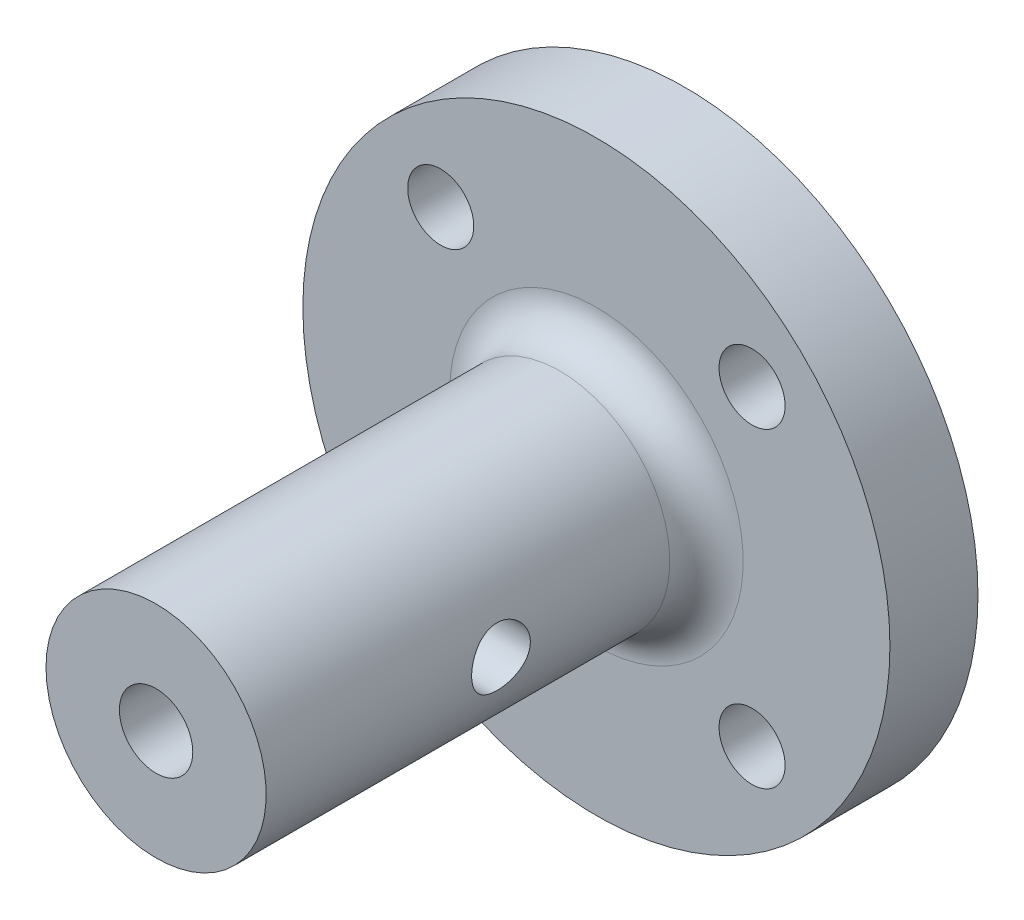
ISO-10303-21;
HEADER;
FILE_DESCRIPTION(('STEP AP214'),'2;1');
FILE_NAME('part.step','',(''),(''),'','','');
FILE_SCHEMA(('AUTOMOTIVE_DESIGN { 1 0 10303 214 1 1 1 1 }'));
ENDSEC;
DATA;
#1=APPLICATION_CONTEXT('core data for automotive mechanical design processes');
#2=APPLICATION_PROTOCOL_DEFINITION('international standard','automotive_design',2000,#1);
#3=PRODUCT_CONTEXT('',#1,'mechanical');
#4=PRODUCT('Part','Part','',(#3));
#5=PRODUCT_RELATED_PRODUCT_CATEGORY('part','',(#4));
#6=PRODUCT_DEFINITION_FORMATION('','',#4);
#7=PRODUCT_DEFINITION_CONTEXT('part definition',#1,'design');
#8=PRODUCT_DEFINITION('design','',#6,#7);
#9=PRODUCT_DEFINITION_SHAPE('','',#8);
#10=(LENGTH_UNIT() NAMED_UNIT(*) SI_UNIT(.MILLI.,.METRE.));
#11=(NAMED_UNIT(*) PLANE_ANGLE_UNIT() SI_UNIT($,.RADIAN.));
#12=(NAMED_UNIT(*) SI_UNIT($,.STERADIAN.) SOLID_ANGLE_UNIT());
#13=UNCERTAINTY_MEASURE_WITH_UNIT(LENGTH_MEASURE(1.E-05),#10,'distance_accuracy_value','');
#14=(GEOMETRIC_REPRESENTATION_CONTEXT(3) GLOBAL_UNCERTAINTY_ASSIGNED_CONTEXT((#13)) GLOBAL_UNIT_ASSIGNED_CONTEXT((#10,
#11,#12)) REPRESENTATION_CONTEXT('',''));
#15=CARTESIAN_POINT('',(0.,0.,0.));
#16=DIRECTION('',(0.,0.,1.));
#17=DIRECTION('',(1.,0.,0.));
#18=AXIS2_PLACEMENT_3D('',#15,#16,#17);
#19=CARTESIAN_POINT('',(0.,0.,0.));
#20=DIRECTION('',(0.,0.,1.));
#21=DIRECTION('',(1.,0.,0.));
#22=AXIS2_PLACEMENT_3D('',#19,#20,#21);
#23=PLANE('',#22);
#24=CARTESIAN_POINT('',(21.213203,-21.213203,0.));
#25=DIRECTION('',(0.,0.,1.));
#26=DIRECTION('',(1.,0.,0.));
#27=AXIS2_PLACEMENT_3D('',#24,#25,#26);
#28=CIRCLE('',#27,4.5);
#29=CARTESIAN_POINT('',(25.713203,-21.213203,0.));
#30=VERTEX_POINT('',#29);
#31=EDGE_CURVE('E174',#30,#30,#28,.T.);
#32=ORIENTED_EDGE('',*,*,#31,.T.);
#33=EDGE_LOOP('',(#32));
#34=FACE_BOUND('',#33,.T.);
#35=CARTESIAN_POINT('',(-21.213203,-21.213203,0.));
#36=DIRECTION('',(0.,0.,1.));
#37=DIRECTION('',(1.,0.,0.));
#38=AXIS2_PLACEMENT_3D('',#35,#36,#37);
#39=CIRCLE('',#38,4.5);
#40=CARTESIAN_POINT('',(-16.713203,-21.213203,0.));
#41=VERTEX_POINT('',#40);
#42=EDGE_CURVE('E179',#41,#41,#39,.T.);
#43=ORIENTED_EDGE('',*,*,#42,.T.);
#44=EDGE_LOOP('',(#43));
#45=FACE_BOUND('',#44,.T.);
#46=CARTESIAN_POINT('',(-21.213203,21.213203,0.));
#47=DIRECTION('',(0.,0.,1.));
#48=DIRECTION('',(1.,0.,0.));
#49=AXIS2_PLACEMENT_3D('',#46,#47,#48);
#50=CIRCLE('',#49,4.5);
#51=CARTESIAN_POINT('',(-16.713203,21.213203,0.));
#52=VERTEX_POINT('',#51);
#53=EDGE_CURVE('E184',#52,#52,#50,.T.);
#54=ORIENTED_EDGE('',*,*,#53,.T.);
#55=EDGE_LOOP('',(#54));
#56=FACE_BOUND('',#55,.T.);
#57=CARTESIAN_POINT('',(21.213203,21.213203,0.));
#58=DIRECTION('',(0.,0.,1.));
#59=DIRECTION('',(1.,0.,0.));
#60=AXIS2_PLACEMENT_3D('',#57,#58,#59);
#61=CIRCLE('',#60,4.5);
#62=CARTESIAN_POINT('',(25.713203,21.213203,0.));
#63=VERTEX_POINT('',#62);
#64=EDGE_CURVE('E170',#63,#63,#61,.T.);
#65=ORIENTED_EDGE('',*,*,#64,.T.);
#66=EDGE_LOOP('',(#65));
#67=FACE_BOUND('',#66,.T.);
#68=CARTESIAN_POINT('',(0.,0.,0.));
#69=DIRECTION('',(0.,0.,-1.));
#70=DIRECTION('',(-1.,0.,0.));
#71=AXIS2_PLACEMENT_3D('',#68,#69,#70);
#72=CIRCLE('',#71,40.);
#73=CARTESIAN_POINT('',(-40.,0.,0.));
#74=VERTEX_POINT('',#73);
#75=EDGE_CURVE('E64',#74,#74,#72,.T.);
#76=ORIENTED_EDGE('',*,*,#75,.T.);
#77=EDGE_LOOP('',(#76));
#78=FACE_BOUND('',#77,.T.);
#79=ADVANCED_FACE('F49',(#34,#45,#56,#67,#78),#23,.F.);
#80=CARTESIAN_POINT('',(0.,0.,0.));
#81=DIRECTION('',(0.,0.,-1.));
#82=DIRECTION('',(-1.,0.,0.));
#83=AXIS2_PLACEMENT_3D('',#80,#81,#82);
#84=CYLINDRICAL_SURFACE('',#83,40.);
#85=ORIENTED_EDGE('',*,*,#75,.F.);
#86=EDGE_LOOP('',(#85));
#87=FACE_BOUND('',#86,.T.);
#88=CARTESIAN_POINT('',(0.,0.,12.));
#89=DIRECTION('',(0.,0.,-1.));
#90=DIRECTION('',(-1.,0.,0.));
#91=AXIS2_PLACEMENT_3D('',#88,#89,#90);
#92=CIRCLE('',#91,40.);
#93=CARTESIAN_POINT('',(-40.,0.,12.));
#94=VERTEX_POINT('',#93);
#95=EDGE_CURVE('E68',#94,#94,#92,.T.);
#96=ORIENTED_EDGE('',*,*,#95,.T.);
#97=EDGE_LOOP('',(#96));
#98=FACE_BOUND('',#97,.T.);
#99=ADVANCED_FACE('F120',(#87,#98),#84,.T.);
#100=CARTESIAN_POINT('',(40.,0.,12.));
#101=DIRECTION('',(0.,0.,-1.));
#102=DIRECTION('',(-1.,0.,0.));
#103=AXIS2_PLACEMENT_3D('',#100,#101,#102);
#104=PLANE('',#103);
#105=CARTESIAN_POINT('',(0.,0.,12.));
#106=DIRECTION('',(0.,0.,-1.));
#107=DIRECTION('',(-1.,0.,0.));
#108=AXIS2_PLACEMENT_3D('',#105,#106,#107);
#109=CIRCLE('',#108,20.);
#110=CARTESIAN_POINT('',(-20.,0.,12.));
#111=VERTEX_POINT('',#110);
#112=EDGE_CURVE('E58',#111,#111,#109,.T.);
#113=ORIENTED_EDGE('',*,*,#112,.T.);
#114=EDGE_LOOP('',(#113));
#115=FACE_BOUND('',#114,.T.);
#116=CARTESIAN_POINT('',(21.213203,-21.213203,12.));
#117=DIRECTION('',(0.,0.,1.));
#118=DIRECTION('',(1.,0.,0.));
#119=AXIS2_PLACEMENT_3D('',#116,#117,#118);
#120=CIRCLE('',#119,4.5);
#121=CARTESIAN_POINT('',(25.713203,-21.213203,12.));
#122=VERTEX_POINT('',#121);
#123=EDGE_CURVE('E137',#122,#122,#120,.T.);
#124=ORIENTED_EDGE('',*,*,#123,.F.);
#125=EDGE_LOOP('',(#124));
#126=FACE_BOUND('',#125,.T.);
#127=CARTESIAN_POINT('',(-21.213203,-21.213203,12.));
#128=DIRECTION('',(0.,0.,1.));
#129=DIRECTION('',(1.,0.,0.));
#130=AXIS2_PLACEMENT_3D('',#127,#128,#129);
#131=CIRCLE('',#130,4.5);
#132=CARTESIAN_POINT('',(-16.713203,-21.213203,12.));
#133=VERTEX_POINT('',#132);
#134=EDGE_CURVE('E141',#133,#133,#131,.T.);
#135=ORIENTED_EDGE('',*,*,#134,.F.);
#136=EDGE_LOOP('',(#135));
#137=FACE_BOUND('',#136,.T.);
#138=CARTESIAN_POINT('',(-21.213203,21.213203,12.));
#139=DIRECTION('',(0.,0.,1.));
#140=DIRECTION('',(1.,0.,0.));
#141=AXIS2_PLACEMENT_3D('',#138,#139,#140);
#142=CIRCLE('',#141,4.5);
#143=CARTESIAN_POINT('',(-16.713203,21.213203,12.));
#144=VERTEX_POINT('',#143);
#145=EDGE_CURVE('E145',#144,#144,#142,.T.);
#146=ORIENTED_EDGE('',*,*,#145,.F.);
#147=EDGE_LOOP('',(#146));
#148=FACE_BOUND('',#147,.T.);
#149=CARTESIAN_POINT('',(21.213203,21.213203,12.));
#150=DIRECTION('',(0.,0.,1.));
#151=DIRECTION('',(1.,0.,0.));
#152=AXIS2_PLACEMENT_3D('',#149,#150,#151);
#153=CIRCLE('',#152,4.5);
#154=CARTESIAN_POINT('',(25.713203,21.213203,12.));
#155=VERTEX_POINT('',#154);
#156=EDGE_CURVE('E149',#155,#155,#153,.T.);
#157=ORIENTED_EDGE('',*,*,#156,.F.);
#158=EDGE_LOOP('',(#157));
#159=FACE_BOUND('',#158,.T.);
#160=ORIENTED_EDGE('',*,*,#95,.F.);
#161=EDGE_LOOP('',(#160));
#162=FACE_BOUND('',#161,.T.);
#163=ADVANCED_FACE('F116',(#115,#126,#137,#148,#159,#162),#104,.F.);
#164=CARTESIAN_POINT('',(0.,0.,0.));
#165=DIRECTION('',(0.,0.,-1.));
#166=DIRECTION('',(-1.,0.,0.));
#167=AXIS2_PLACEMENT_3D('',#164,#165,#166);
#168=CYLINDRICAL_SURFACE('',#167,15.);
#169=CARTESIAN_POINT('',(0.,0.,17.));
#170=DIRECTION('',(0.,0.,-1.));
#171=DIRECTION('',(-1.,0.,0.));
#172=AXIS2_PLACEMENT_3D('',#169,#170,#171);
#173=CIRCLE('',#172,15.);
#174=CARTESIAN_POINT('',(-15.,0.,17.));
#175=VERTEX_POINT('',#174);
#176=EDGE_CURVE('E10',#175,#175,#173,.F.);
#177=ORIENTED_EDGE('',*,*,#176,.T.);
#178=EDGE_LOOP('',(#177));
#179=FACE_BOUND('',#178,.T.);
#180=CARTESIAN_POINT('',(-15.,0.,44.));
#181=CARTESIAN_POINT('',(-14.9999966762032,-0.220509111665708,43.9999947661303));
#182=CARTESIAN_POINT('',(-14.995089723243,-0.44107432044368,43.9817047716207));
#183=CARTESIAN_POINT('',(-14.9759914724332,-0.875850902708926,43.9091575385226));
#184=CARTESIAN_POINT('',(-14.9617957066517,-1.09005916663817,43.8548829911478));
#185=CARTESIAN_POINT('',(-14.9256866650558,-1.50578317809062,43.7122566662719));
#186=CARTESIAN_POINT('',(-14.9037833426075,-1.70731490203057,43.623948824668));
#187=CARTESIAN_POINT('',(-14.8545739830336,-2.09270737278532,43.4159255146668));
#188=CARTESIAN_POINT('',(-14.8272675859036,-2.27656694089925,43.2962079532814));
#189=CARTESIAN_POINT('',(-14.7694922980399,-2.62565900748003,43.0258329671733));
#190=CARTESIAN_POINT('',(-14.7389693535736,-2.79042337972557,42.8745826639835));
#191=CARTESIAN_POINT('',(-14.6785481935918,-3.09257427321275,42.5467030338733));
#192=CARTESIAN_POINT('',(-14.6486500589449,-3.22995726991328,42.3700704447649));
#193=CARTESIAN_POINT('',(-14.5923107492874,-3.4757281848683,41.9927035303491));
#194=CARTESIAN_POINT('',(-14.5659377712648,-3.58357755472974,41.7916073434765));
#195=CARTESIAN_POINT('',(-14.5204295463637,-3.76375096153988,41.3733197778151));
#196=CARTESIAN_POINT('',(-14.5012929650653,-3.83608154902737,41.1561313753371));
#197=CARTESIAN_POINT('',(-14.472982316048,-3.94153840453008,40.71700892435));
#198=CARTESIAN_POINT('',(-14.4635929562298,-3.97551340489383,40.4952929201385));
#199=CARTESIAN_POINT('',(-14.4551966183274,-4.00594069411639,40.0491246333869));
#200=CARTESIAN_POINT('',(-14.4561877002889,-4.00239999411507,39.8246728699519));
#201=CARTESIAN_POINT('',(-14.4682475760406,-3.95857020005398,39.3860291692519));
#202=CARTESIAN_POINT('',(-14.4790347102306,-3.91930812129529,39.171725635923));
#203=CARTESIAN_POINT('',(-14.5090202616138,-3.80679497444365,38.7528633310875));
#204=CARTESIAN_POINT('',(-14.5282193510522,-3.73354118985989,38.5483053398493));
#205=CARTESIAN_POINT('',(-14.5731132349677,-3.55428713930511,38.1520637123828));
#206=CARTESIAN_POINT('',(-14.5988788563741,-3.44792682275569,37.9605513214275));
#207=CARTESIAN_POINT('',(-14.6539645928489,-3.20573007647555,37.597731682297));
#208=CARTESIAN_POINT('',(-14.6832854071037,-3.06988784448503,37.4264284216871));
#209=CARTESIAN_POINT('',(-14.7433502125973,-2.76733214526838,37.1030220050904));
#210=CARTESIAN_POINT('',(-14.7741094297766,-2.59975625456598,36.9517273633701));
#211=CARTESIAN_POINT('',(-14.8327276255263,-2.24123533641274,36.6792224392994));
#212=CARTESIAN_POINT('',(-14.8605864897711,-2.05028938841018,36.5580133425951));
#213=CARTESIAN_POINT('',(-14.9104364079659,-1.6491965109949,36.3487641943507));
#214=CARTESIAN_POINT('',(-14.9324014566712,-1.43896980510357,36.2608704591028));
#215=CARTESIAN_POINT('',(-14.96780088802,-1.00600458878079,36.1219056223733));
#216=CARTESIAN_POINT('',(-14.981237134675,-0.783268823856645,36.0708264745521));
#217=CARTESIAN_POINT('',(-14.9977831711677,-0.33850816629103,36.0082102461644));
#218=CARTESIAN_POINT('',(-15.0011799494192,-0.11664847528276,35.9955739202983));
#219=CARTESIAN_POINT('',(-14.9980894338339,0.326020091802398,36.0071663284939));
#220=CARTESIAN_POINT('',(-14.9916031616071,0.546829074124229,36.0313912522115));
#221=CARTESIAN_POINT('',(-14.9696607099204,0.977204899803559,36.11511689492));
#222=CARTESIAN_POINT('',(-14.9543605309265,1.18689970405556,36.1740044923955));
#223=CARTESIAN_POINT('',(-14.9165258978828,1.59341394235213,36.3246718890159));
#224=CARTESIAN_POINT('',(-14.8939906599234,1.79023197843205,36.4164552525011));
#225=CARTESIAN_POINT('',(-14.8435132111904,2.1696769493359,36.6323477743611));
#226=CARTESIAN_POINT('',(-14.8154737320985,2.35195037692236,36.7570549335955));
#227=CARTESIAN_POINT('',(-14.7572290473119,2.69336927079429,37.034503260316));
#228=CARTESIAN_POINT('',(-14.7270234145527,2.85251015759837,37.1872499652021));
#229=CARTESIAN_POINT('',(-14.6667949173317,3.14777848957546,37.5215711549892));
#230=CARTESIAN_POINT('',(-14.6368012285772,3.28313038499626,37.7038371227905));
#231=CARTESIAN_POINT('',(-14.5813289436636,3.52134382370241,38.0891293921991));
#232=CARTESIAN_POINT('',(-14.5558501591602,3.62420672244342,38.292154827244));
#233=CARTESIAN_POINT('',(-14.5125853674305,3.79374823172204,38.7121906141529));
#234=CARTESIAN_POINT('',(-14.4947549662348,3.8606362450784,38.9291116236376));
#235=CARTESIAN_POINT('',(-14.4687965026614,3.95682410237656,39.3716786393471));
#236=CARTESIAN_POINT('',(-14.4606659608681,3.98613355205235,39.5973224006868));
#237=CARTESIAN_POINT('',(-14.4552348910192,4.00577979307211,40.0429895757886));
#238=CARTESIAN_POINT('',(-14.4575879532022,3.99736311235128,40.2629546405733));
#239=CARTESIAN_POINT('',(-14.4720479199639,3.94468751999857,40.6982070280705));
#240=CARTESIAN_POINT('',(-14.4841545735456,3.9004295306998,40.9134944710095));
#241=CARTESIAN_POINT('',(-14.5165514219021,3.77805031399794,41.3317115042402));
#242=CARTESIAN_POINT('',(-14.5367777005106,3.70019322151266,41.5347236854591));
#243=CARTESIAN_POINT('',(-14.5831363626058,3.51303109124665,41.9249576610735));
#244=CARTESIAN_POINT('',(-14.6092696723953,3.40372112049204,42.1121769726024));
#245=CARTESIAN_POINT('',(-14.6654584288421,3.15297818537663,42.4714607189918));
#246=CARTESIAN_POINT('',(-14.6956066620426,3.01069459535826,42.642917069952));
#247=CARTESIAN_POINT('',(-14.7559100756513,2.69966107022192,42.959924903335));
#248=CARTESIAN_POINT('',(-14.7860652559664,2.53090470871747,43.1054700773378));
#249=CARTESIAN_POINT('',(-14.8437562480818,2.16735996217739,43.3695844752936));
#250=CARTESIAN_POINT('',(-14.8712222262917,1.97209192350356,43.4875100212986));
#251=CARTESIAN_POINT('',(-14.9196762020573,1.56377728083377,43.6886748318588));
#252=CARTESIAN_POINT('',(-14.9406683536717,1.35074218939259,43.7719363513272));
#253=CARTESIAN_POINT('',(-14.9710950502695,0.948749409761979,43.890550570831));
#254=CARTESIAN_POINT('',(-14.9818554118521,0.761524033130069,43.931498767185));
#255=CARTESIAN_POINT('',(-14.9963089807291,0.38287959063415,43.9862244123341));
#256=CARTESIAN_POINT('',(-15.0000028859454,0.19146094080972,44.0000045444));
#257=CARTESIAN_POINT('',(-15.,0.,44.));
#258=B_SPLINE_CURVE_WITH_KNOTS('',3,(#180,#181,#182,#183,#184,#185,#186,#187,#188,#189,#190,
#191,#192,#193,#194,#195,#196,#197,#198,#199,#200,#201,#202,#203,#204,#205,#206,#207,#208,#209,
#210,#211,#212,#213,#214,#215,#216,#217,#218,#219,#220,#221,#222,#223,#224,#225,#226,#227,#228,
#229,#230,#231,#232,#233,#234,#235,#236,#237,#238,#239,#240,#241,#242,#243,#244,#245,#246,#247,
#248,#249,#250,#251,#252,#253,#254,#255,#256,#257),.UNSPECIFIED.,.T.,.F.,(4,2,2,2,2,2,2,2,2,2,2,
2,2,2,2,2,2,2,2,2,2,2,2,2,2,2,2,2,2,2,2,2,2,2,2,2,2,2,4),(0.,0.660825197899137,1.3219684875229,
1.98226110594386,2.6425977341735,3.31669795909933,3.99088489850297,4.67665165046458,
5.36229188259399,6.03244316500935,6.70246920808639,7.35382004091992,8.00522293625878,
8.66397346692995,9.32285376235258,10.0032251962464,10.6836234387519,11.3669761920608,
12.0501795438028,12.7136543504909,13.377060578507,14.0290707128423,14.6811515155123,
15.346005720091,16.0109913651777,16.6947299276558,17.3784399604821,18.0581259539877,
18.7376381732796,19.394866848109,20.0520786104837,20.7042153090379,21.3564543425319,
22.0278867914996,22.6994824867208,23.3854450456898,24.0709665229755,24.6447963799386,
25.2185695593995),.UNSPECIFIED.);
#259=CARTESIAN_POINT('',(-15.,0.,44.));
#260=VERTEX_POINT('',#259);
#261=EDGE_CURVE('E71',#260,#260,#258,.T.);
#262=ORIENTED_EDGE('',*,*,#261,.T.);
#263=EDGE_LOOP('',(#262));
#264=FACE_BOUND('',#263,.T.);
#265=CARTESIAN_POINT('',(15.,0.,36.));
#266=CARTESIAN_POINT('',(14.9999966762032,-0.220509111665708,36.0000052338697));
#267=CARTESIAN_POINT('',(14.995089723243,-0.441074320443681,36.0182952283794));
#268=CARTESIAN_POINT('',(14.9759914724332,-0.875850902708926,36.0908424614774));
#269=CARTESIAN_POINT('',(14.9617957066517,-1.09005916663817,36.1451170088522));
#270=CARTESIAN_POINT('',(14.9256866650558,-1.50578317809062,36.2877433337281));
#271=CARTESIAN_POINT('',(14.9037833426075,-1.70731490203057,36.376051175332));
#272=CARTESIAN_POINT('',(14.8545739830336,-2.09270737278532,36.5840744853332));
#273=CARTESIAN_POINT('',(14.8272675859036,-2.27656694089925,36.7037920467186));
#274=CARTESIAN_POINT('',(14.7694922980399,-2.62565900748003,36.9741670328267));
#275=CARTESIAN_POINT('',(14.7389693535736,-2.79042337972557,37.1254173360165));
#276=CARTESIAN_POINT('',(14.6785481935918,-3.09257427321275,37.4532969661267));
#277=CARTESIAN_POINT('',(14.6486500589449,-3.22995726991328,37.6299295552351));
#278=CARTESIAN_POINT('',(14.5923107492874,-3.4757281848683,38.0072964696509));
#279=CARTESIAN_POINT('',(14.5659377712648,-3.58357755472974,38.2083926565235));
#280=CARTESIAN_POINT('',(14.5204295463637,-3.76375096153988,38.6266802221849));
#281=CARTESIAN_POINT('',(14.5012929650653,-3.83608154902737,38.8438686246629));
#282=CARTESIAN_POINT('',(14.472982316048,-3.94153840453008,39.28299107565));
#283=CARTESIAN_POINT('',(14.4635929562298,-3.97551340489383,39.5047070798615));
#284=CARTESIAN_POINT('',(14.4551966183274,-4.00594069411639,39.9508753666131));
#285=CARTESIAN_POINT('',(14.4561877002889,-4.00239999411507,40.1753271300481));
#286=CARTESIAN_POINT('',(14.4682475760406,-3.95857020005398,40.6139708307481));
#287=CARTESIAN_POINT('',(14.4790347102306,-3.91930812129529,40.828274364077));
#288=CARTESIAN_POINT('',(14.5090202616138,-3.80679497444365,41.2471366689125));
#289=CARTESIAN_POINT('',(14.5282193510522,-3.73354118985989,41.4516946601507));
#290=CARTESIAN_POINT('',(14.5731132349677,-3.55428713930511,41.8479362876171));
#291=CARTESIAN_POINT('',(14.5988788563741,-3.44792682275569,42.0394486785725));
#292=CARTESIAN_POINT('',(14.6539645928489,-3.20573007647555,42.402268317703));
#293=CARTESIAN_POINT('',(14.6832854071037,-3.06988784448503,42.5735715783129));
#294=CARTESIAN_POINT('',(14.7433502125973,-2.76733214526838,42.8969779949096));
#295=CARTESIAN_POINT('',(14.7741094297766,-2.59975625456598,43.0482726366299));
#296=CARTESIAN_POINT('',(14.8327276255263,-2.24123533641274,43.3207775607006));
#297=CARTESIAN_POINT('',(14.8605864897711,-2.05028938841018,43.4419866574049));
#298=CARTESIAN_POINT('',(14.9104364079659,-1.6491965109949,43.6512358056493));
#299=CARTESIAN_POINT('',(14.9324014566712,-1.43896980510357,43.7391295408972));
#300=CARTESIAN_POINT('',(14.96780088802,-1.00600458878079,43.8780943776268));
#301=CARTESIAN_POINT('',(14.981237134675,-0.783268823856645,43.9291735254479));
#302=CARTESIAN_POINT('',(14.9977831711677,-0.33850816629103,43.9917897538356));
#303=CARTESIAN_POINT('',(15.0011799494192,-0.11664847528276,44.0044260797017));
#304=CARTESIAN_POINT('',(14.9980894338339,0.326020091802398,43.9928336715061));
#305=CARTESIAN_POINT('',(14.9916031616071,0.546829074124229,43.9686087477885));
#306=CARTESIAN_POINT('',(14.9696607099204,0.977204899803559,43.88488310508));
#307=CARTESIAN_POINT('',(14.9543605309265,1.18689970405556,43.8259955076045));
#308=CARTESIAN_POINT('',(14.9165258978828,1.59341394235213,43.6753281109841));
#309=CARTESIAN_POINT('',(14.8939906599234,1.79023197843205,43.5835447474989));
#310=CARTESIAN_POINT('',(14.8435132111904,2.1696769493359,43.3676522256389));
#311=CARTESIAN_POINT('',(14.8154737320985,2.35195037692236,43.2429450664045));
#312=CARTESIAN_POINT('',(14.7572290473119,2.69336927079429,42.965496739684));
#313=CARTESIAN_POINT('',(14.7270234145527,2.85251015759837,42.8127500347979));
#314=CARTESIAN_POINT('',(14.6667949173317,3.14777848957546,42.4784288450108));
#315=CARTESIAN_POINT('',(14.6368012285772,3.28313038499627,42.2961628772095));
#316=CARTESIAN_POINT('',(14.5813289436636,3.52134382370242,41.9108706078009));
#317=CARTESIAN_POINT('',(14.5558501591602,3.62420672244342,41.707845172756));
#318=CARTESIAN_POINT('',(14.5125853674305,3.79374823172204,41.2878093858471));
#319=CARTESIAN_POINT('',(14.4947549662348,3.8606362450784,41.0708883763624));
#320=CARTESIAN_POINT('',(14.4687965026614,3.95682410237656,40.6283213606529));
#321=CARTESIAN_POINT('',(14.4606659608681,3.98613355205235,40.4026775993132));
#322=CARTESIAN_POINT('',(14.4552348910192,4.00577979307211,39.9570104242114));
#323=CARTESIAN_POINT('',(14.4575879532022,3.99736311235128,39.7370453594267));
#324=CARTESIAN_POINT('',(14.4720479199639,3.94468751999857,39.3017929719295));
#325=CARTESIAN_POINT('',(14.4841545735456,3.9004295306998,39.0865055289905));
#326=CARTESIAN_POINT('',(14.5165514219021,3.77805031399794,38.6682884957598));
#327=CARTESIAN_POINT('',(14.5367777005106,3.70019322151266,38.4652763145409));
#328=CARTESIAN_POINT('',(14.5831363626058,3.51303109124665,38.0750423389265));
#329=CARTESIAN_POINT('',(14.6092696723953,3.40372112049204,37.8878230273976));
#330=CARTESIAN_POINT('',(14.6654584288421,3.15297818537663,37.5285392810082));
#331=CARTESIAN_POINT('',(14.6956066620426,3.01069459535826,37.357082930048));
#332=CARTESIAN_POINT('',(14.7559100756513,2.69966107022192,37.040075096665));
#333=CARTESIAN_POINT('',(14.7860652559664,2.53090470871747,36.8945299226622));
#334=CARTESIAN_POINT('',(14.8437562480818,2.16735996217739,36.6304155247064));
#335=CARTESIAN_POINT('',(14.8712222262917,1.97209192350357,36.5124899787014));
#336=CARTESIAN_POINT('',(14.9196762020573,1.56377728083377,36.3113251681413));
#337=CARTESIAN_POINT('',(14.9406683536717,1.35074218939259,36.2280636486728));
#338=CARTESIAN_POINT('',(14.9710950502695,0.94874940976198,36.109449429169));
#339=CARTESIAN_POINT('',(14.9818554118521,0.761524033130069,36.068501232815));
#340=CARTESIAN_POINT('',(14.9963089807291,0.38287959063415,36.0137755876659));
#341=CARTESIAN_POINT('',(15.0000028859454,0.19146094080972,35.9999954556));
#342=CARTESIAN_POINT('',(15.,0.,36.));
#343=B_SPLINE_CURVE_WITH_KNOTS('',3,(#265,#266,#267,#268,#269,#270,#271,#272,#273,#274,#275,
#276,#277,#278,#279,#280,#281,#282,#283,#284,#285,#286,#287,#288,#289,#290,#291,#292,#293,#294,
#295,#296,#297,#298,#299,#300,#301,#302,#303,#304,#305,#306,#307,#308,#309,#310,#311,#312,#313,
#314,#315,#316,#317,#318,#319,#320,#321,#322,#323,#324,#325,#326,#327,#328,#329,#330,#331,#332,
#333,#334,#335,#336,#337,#338,#339,#340,#341,#342),.UNSPECIFIED.,.T.,.F.,(4,2,2,2,2,2,2,2,2,2,2,
2,2,2,2,2,2,2,2,2,2,2,2,2,2,2,2,2,2,2,2,2,2,2,2,2,2,2,4),(0.,0.660825197899138,1.3219684875229,
1.98226110594386,2.6425977341735,3.31669795909933,3.99088489850297,4.67665165046458,
5.36229188259399,6.03244316500935,6.70246920808639,7.35382004091992,8.00522293625878,
8.66397346692995,9.32285376235258,10.0032251962464,10.6836234387519,11.3669761920608,
12.0501795438028,12.7136543504909,13.377060578507,14.0290707128423,14.6811515155123,
15.346005720091,16.0109913651777,16.6947299276558,17.3784399604821,18.0581259539877,
18.7376381732796,19.394866848109,20.0520786104837,20.7042153090379,21.3564543425319,
22.0278867914996,22.6994824867208,23.3854450456898,24.0709665229755,24.6447963799386,
25.2185695593995),.UNSPECIFIED.);
#344=CARTESIAN_POINT('',(15.,0.,36.));
#345=VERTEX_POINT('',#344);
#346=EDGE_CURVE('E81',#345,#345,#343,.T.);
#347=ORIENTED_EDGE('',*,*,#346,.T.);
#348=EDGE_LOOP('',(#347));
#349=FACE_BOUND('',#348,.T.);
#350=CARTESIAN_POINT('',(0.,0.,72.));
#351=DIRECTION('',(0.,0.,-1.));
#352=DIRECTION('',(-1.,0.,0.));
#353=AXIS2_PLACEMENT_3D('',#350,#351,#352);
#354=CIRCLE('',#353,15.);
#355=CARTESIAN_POINT('',(-15.,0.,72.));
#356=VERTEX_POINT('',#355);
#357=EDGE_CURVE('E154',#356,#356,#354,.T.);
#358=ORIENTED_EDGE('',*,*,#357,.T.);
#359=EDGE_LOOP('',(#358));
#360=FACE_BOUND('',#359,.T.);
#361=ADVANCED_FACE('F86',(#179,#264,#349,#360),#168,.T.);
#362=CARTESIAN_POINT('',(15.,0.,72.));
#363=DIRECTION('',(0.,0.,-1.));
#364=DIRECTION('',(-1.,0.,0.));
#365=AXIS2_PLACEMENT_3D('',#362,#363,#364);
#366=PLANE('',#365);
#367=CARTESIAN_POINT('',(0.,0.,72.));
#368=DIRECTION('',(0.,0.,1.));
#369=DIRECTION('',(1.,0.,0.));
#370=AXIS2_PLACEMENT_3D('',#367,#368,#369);
#371=CIRCLE('',#370,5.);
#372=CARTESIAN_POINT('',(5.,0.,72.));
#373=VERTEX_POINT('',#372);
#374=EDGE_CURVE('E80',#373,#373,#371,.T.);
#375=ORIENTED_EDGE('',*,*,#374,.F.);
#376=EDGE_LOOP('',(#375));
#377=FACE_BOUND('',#376,.T.);
#378=ORIENTED_EDGE('',*,*,#357,.F.);
#379=EDGE_LOOP('',(#378));
#380=FACE_BOUND('',#379,.T.);
#381=ADVANCED_FACE('F110',(#377,#380),#366,.F.);
#382=CARTESIAN_POINT('',(0.,0.,52.));
#383=DIRECTION('',(0.,0.,1.));
#384=DIRECTION('',(1.,0.,0.));
#385=AXIS2_PLACEMENT_3D('',#382,#383,#384);
#386=CYLINDRICAL_SURFACE('',#385,5.);
#387=CARTESIAN_POINT('',(0.,0.,52.));
#388=DIRECTION('',(0.,0.,1.));
#389=DIRECTION('',(1.,0.,0.));
#390=AXIS2_PLACEMENT_3D('',#387,#388,#389);
#391=CIRCLE('',#390,5.);
#392=CARTESIAN_POINT('',(5.,0.,52.));
#393=VERTEX_POINT('',#392);
#394=EDGE_CURVE('E160',#393,#393,#391,.T.);
#395=ORIENTED_EDGE('',*,*,#394,.F.);
#396=EDGE_LOOP('',(#395));
#397=FACE_BOUND('',#396,.T.);
#398=ORIENTED_EDGE('',*,*,#374,.T.);
#399=EDGE_LOOP('',(#398));
#400=FACE_BOUND('',#399,.T.);
#401=ADVANCED_FACE('F105',(#397,#400),#386,.F.);
#402=CARTESIAN_POINT('',(0.,0.,52.));
#403=DIRECTION('',(0.,0.,1.));
#404=DIRECTION('',(1.,0.,0.));
#405=AXIS2_PLACEMENT_3D('',#402,#403,#404);
#406=PLANE('',#405);
#407=ORIENTED_EDGE('',*,*,#394,.T.);
#408=EDGE_LOOP('',(#407));
#409=FACE_BOUND('',#408,.T.);
#410=ADVANCED_FACE('F99',(#409),#406,.T.);
#411=CARTESIAN_POINT('',(-81.,0.,40.));
#412=DIRECTION('',(1.,0.,0.));
#413=DIRECTION('',(0.,0.,-1.));
#414=AXIS2_PLACEMENT_3D('',#411,#412,#413);
#415=CYLINDRICAL_SURFACE('',#414,4.);
#416=ORIENTED_EDGE('',*,*,#346,.F.);
#417=EDGE_LOOP('',(#416));
#418=FACE_BOUND('',#417,.T.);
#419=ORIENTED_EDGE('',*,*,#261,.F.);
#420=EDGE_LOOP('',(#419));
#421=FACE_BOUND('',#420,.T.);
#422=ADVANCED_FACE('F91',(#418,#421),#415,.F.);
#423=CARTESIAN_POINT('',(21.213203,21.213203,0.));
#424=DIRECTION('',(0.,0.,1.));
#425=DIRECTION('',(1.,0.,0.));
#426=AXIS2_PLACEMENT_3D('',#423,#424,#425);
#427=CYLINDRICAL_SURFACE('',#426,4.5);
#428=ORIENTED_EDGE('',*,*,#64,.F.);
#429=EDGE_LOOP('',(#428));
#430=FACE_BOUND('',#429,.T.);
#431=ORIENTED_EDGE('',*,*,#156,.T.);
#432=EDGE_LOOP('',(#431));
#433=FACE_BOUND('',#432,.T.);
#434=ADVANCED_FACE('F98',(#430,#433),#427,.F.);
#435=CARTESIAN_POINT('',(-21.213203,21.213203,0.));
#436=DIRECTION('',(0.,0.,1.));
#437=DIRECTION('',(1.,0.,0.));
#438=AXIS2_PLACEMENT_3D('',#435,#436,#437);
#439=CYLINDRICAL_SURFACE('',#438,4.5);
#440=ORIENTED_EDGE('',*,*,#53,.F.);
#441=EDGE_LOOP('',(#440));
#442=FACE_BOUND('',#441,.T.);
#443=ORIENTED_EDGE('',*,*,#145,.T.);
#444=EDGE_LOOP('',(#443));
#445=FACE_BOUND('',#444,.T.);
#446=ADVANCED_FACE('F190',(#442,#445),#439,.F.);
#447=CARTESIAN_POINT('',(-21.213203,-21.213203,0.));
#448=DIRECTION('',(0.,0.,1.));
#449=DIRECTION('',(1.,0.,0.));
#450=AXIS2_PLACEMENT_3D('',#447,#448,#449);
#451=CYLINDRICAL_SURFACE('',#450,4.5);
#452=ORIENTED_EDGE('',*,*,#42,.F.);
#453=EDGE_LOOP('',(#452));
#454=FACE_BOUND('',#453,.T.);
#455=ORIENTED_EDGE('',*,*,#134,.T.);
#456=EDGE_LOOP('',(#455));
#457=FACE_BOUND('',#456,.T.);
#458=ADVANCED_FACE('F192',(#454,#457),#451,.F.);
#459=CARTESIAN_POINT('',(21.213203,-21.213203,0.));
#460=DIRECTION('',(0.,0.,1.));
#461=DIRECTION('',(1.,0.,0.));
#462=AXIS2_PLACEMENT_3D('',#459,#460,#461);
#463=CYLINDRICAL_SURFACE('',#462,4.5);
#464=ORIENTED_EDGE('',*,*,#31,.F.);
#465=EDGE_LOOP('',(#464));
#466=FACE_BOUND('',#465,.T.);
#467=ORIENTED_EDGE('',*,*,#123,.T.);
#468=EDGE_LOOP('',(#467));
#469=FACE_BOUND('',#468,.T.);
#470=ADVANCED_FACE('F198',(#466,#469),#463,.F.);
#471=CARTESIAN_POINT('',(0.,0.,17.));
#472=DIRECTION('',(0.,0.,-1.));
#473=DIRECTION('',(-1.,0.,0.));
#474=AXIS2_PLACEMENT_3D('',#471,#472,#473);
#475=TOROIDAL_SURFACE('',#474,20.,5.);
#476=ORIENTED_EDGE('',*,*,#176,.F.);
#477=EDGE_LOOP('',(#476));
#478=FACE_BOUND('',#477,.T.);
#479=ORIENTED_EDGE('',*,*,#112,.F.);
#480=EDGE_LOOP('',(#479));
#481=FACE_BOUND('',#480,.T.);
#482=ADVANCED_FACE('F52',(#478,#481),#475,.F.);
#483=CLOSED_SHELL('',(#79,#99,#163,#361,#381,#401,#410,#422,#434,#446,#458,#470,#482));
#484=MANIFOLD_SOLID_BREP('B2',#483);
#485=ADVANCED_BREP_SHAPE_REPRESENTATION('',(#18,#484),#14);
#486=SHAPE_DEFINITION_REPRESENTATION(#9,#485);
ENDSEC;
END-ISO-10303-21;
